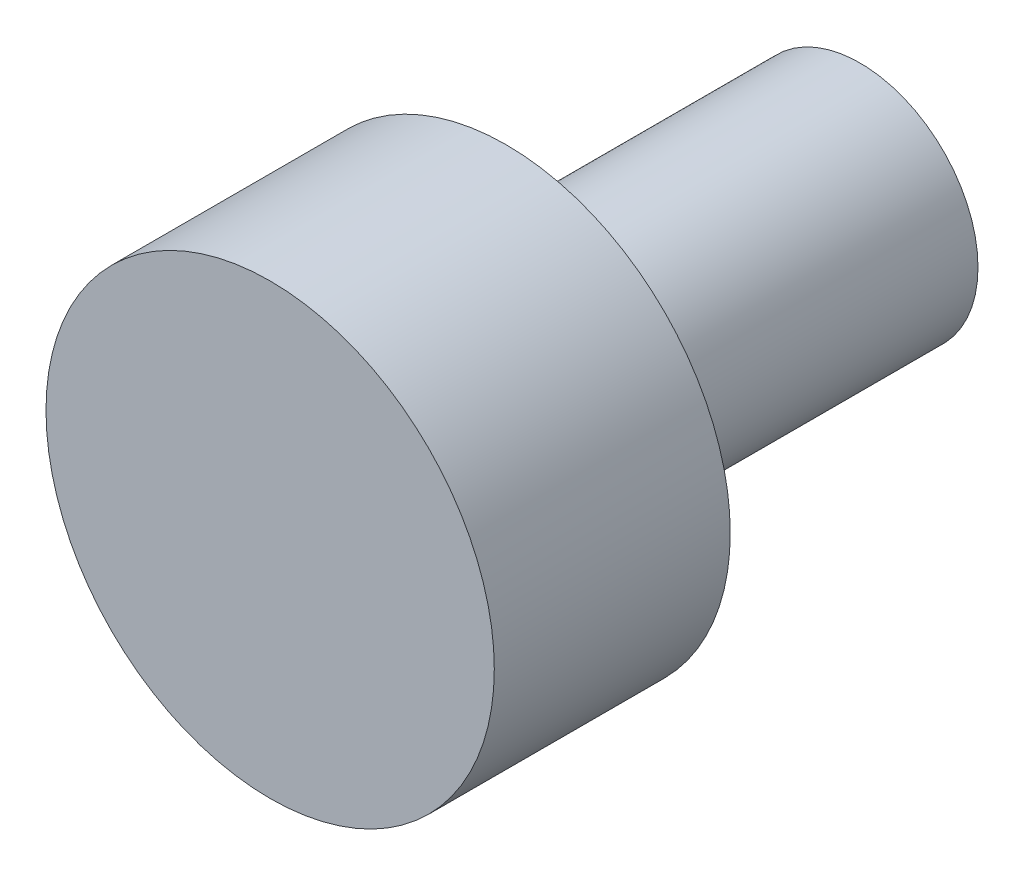
ISO-10303-21;
HEADER;
FILE_DESCRIPTION(('STEP AP214'),'2;1');
FILE_NAME('part.step','',(''),(''),'','','');
FILE_SCHEMA(('AUTOMOTIVE_DESIGN { 1 0 10303 214 1 1 1 1 }'));
ENDSEC;
DATA;
#1=APPLICATION_CONTEXT('core data for automotive mechanical design processes');
#2=APPLICATION_PROTOCOL_DEFINITION('international standard','automotive_design',2000,#1);
#3=PRODUCT_CONTEXT('',#1,'mechanical');
#4=PRODUCT('Part','Part','',(#3));
#5=PRODUCT_RELATED_PRODUCT_CATEGORY('part','',(#4));
#6=PRODUCT_DEFINITION_FORMATION('','',#4);
#7=PRODUCT_DEFINITION_CONTEXT('part definition',#1,'design');
#8=PRODUCT_DEFINITION('design','',#6,#7);
#9=PRODUCT_DEFINITION_SHAPE('','',#8);
#10=(LENGTH_UNIT() NAMED_UNIT(*) SI_UNIT(.MILLI.,.METRE.));
#11=(NAMED_UNIT(*) PLANE_ANGLE_UNIT() SI_UNIT($,.RADIAN.));
#12=(NAMED_UNIT(*) SI_UNIT($,.STERADIAN.) SOLID_ANGLE_UNIT());
#13=UNCERTAINTY_MEASURE_WITH_UNIT(LENGTH_MEASURE(1.E-05),#10,'distance_accuracy_value','');
#14=(GEOMETRIC_REPRESENTATION_CONTEXT(3) GLOBAL_UNCERTAINTY_ASSIGNED_CONTEXT((#13)) GLOBAL_UNIT_ASSIGNED_CONTEXT((#10,
#11,#12)) REPRESENTATION_CONTEXT('',''));
#15=CARTESIAN_POINT('',(0.,0.,0.));
#16=DIRECTION('',(0.,0.,1.));
#17=DIRECTION('',(1.,0.,0.));
#18=AXIS2_PLACEMENT_3D('',#15,#16,#17);
#19=CARTESIAN_POINT('',(0.,0.,0.));
#20=DIRECTION('',(0.,0.,-1.));
#21=DIRECTION('',(-1.,0.,0.));
#22=AXIS2_PLACEMENT_3D('',#19,#20,#21);
#23=CYLINDRICAL_SURFACE('',#22,1.);
#24=CARTESIAN_POINT('',(0.,0.,0.));
#25=DIRECTION('',(0.,0.,1.));
#26=DIRECTION('',(1.,0.,0.));
#27=AXIS2_PLACEMENT_3D('',#24,#25,#26);
#28=CIRCLE('',#27,1.);
#29=CARTESIAN_POINT('',(1.,0.,0.));
#30=VERTEX_POINT('',#29);
#31=EDGE_CURVE('E10',#30,#30,#28,.T.);
#32=ORIENTED_EDGE('',*,*,#31,.F.);
#33=EDGE_LOOP('',(#32));
#34=FACE_BOUND('',#33,.T.);
#35=CARTESIAN_POINT('',(0.,0.,-3.));
#36=DIRECTION('',(0.,0.,1.));
#37=DIRECTION('',(1.,0.,0.));
#38=AXIS2_PLACEMENT_3D('',#35,#36,#37);
#39=CIRCLE('',#38,1.);
#40=CARTESIAN_POINT('',(1.,0.,-3.));
#41=VERTEX_POINT('',#40);
#42=EDGE_CURVE('E37',#41,#41,#39,.T.);
#43=ORIENTED_EDGE('',*,*,#42,.T.);
#44=EDGE_LOOP('',(#43));
#45=FACE_BOUND('',#44,.T.);
#46=ADVANCED_FACE('F40',(#34,#45),#23,.T.);
#47=CARTESIAN_POINT('',(0.,0.,-3.));
#48=DIRECTION('',(0.,0.,1.));
#49=DIRECTION('',(1.,0.,0.));
#50=AXIS2_PLACEMENT_3D('',#47,#48,#49);
#51=PLANE('',#50);
#52=ORIENTED_EDGE('',*,*,#42,.F.);
#53=EDGE_LOOP('',(#52));
#54=FACE_BOUND('',#53,.T.);
#55=ADVANCED_FACE('F58',(#54),#51,.F.);
#56=CARTESIAN_POINT('',(0.,0.,2.));
#57=DIRECTION('',(0.,0.,-1.));
#58=DIRECTION('',(-1.,0.,0.));
#59=AXIS2_PLACEMENT_3D('',#56,#57,#58);
#60=CYLINDRICAL_SURFACE('',#59,1.9);
#61=CARTESIAN_POINT('',(0.,0.,2.));
#62=DIRECTION('',(0.,0.,1.));
#63=DIRECTION('',(1.,0.,0.));
#64=AXIS2_PLACEMENT_3D('',#61,#62,#63);
#65=CIRCLE('',#64,1.9);
#66=CARTESIAN_POINT('',(1.9,0.,2.));
#67=VERTEX_POINT('',#66);
#68=EDGE_CURVE('E50',#67,#67,#65,.T.);
#69=ORIENTED_EDGE('',*,*,#68,.F.);
#70=EDGE_LOOP('',(#69));
#71=FACE_BOUND('',#70,.T.);
#72=CARTESIAN_POINT('',(0.,0.,0.));
#73=DIRECTION('',(0.,0.,1.));
#74=DIRECTION('',(1.,0.,0.));
#75=AXIS2_PLACEMENT_3D('',#72,#73,#74);
#76=CIRCLE('',#75,1.9);
#77=CARTESIAN_POINT('',(1.9,0.,0.));
#78=VERTEX_POINT('',#77);
#79=EDGE_CURVE('E47',#78,#78,#76,.T.);
#80=ORIENTED_EDGE('',*,*,#79,.T.);
#81=EDGE_LOOP('',(#80));
#82=FACE_BOUND('',#81,.T.);
#83=ADVANCED_FACE('F60',(#71,#82),#60,.T.);
#84=CARTESIAN_POINT('',(0.,0.,2.));
#85=DIRECTION('',(0.,0.,1.));
#86=DIRECTION('',(1.,0.,0.));
#87=AXIS2_PLACEMENT_3D('',#84,#85,#86);
#88=PLANE('',#87);
#89=ORIENTED_EDGE('',*,*,#68,.T.);
#90=EDGE_LOOP('',(#89));
#91=FACE_BOUND('',#90,.T.);
#92=ADVANCED_FACE('F54',(#91),#88,.T.);
#93=CARTESIAN_POINT('',(0.,0.,0.));
#94=DIRECTION('',(0.,0.,1.));
#95=DIRECTION('',(1.,0.,0.));
#96=AXIS2_PLACEMENT_3D('',#93,#94,#95);
#97=PLANE('',#96);
#98=ORIENTED_EDGE('',*,*,#31,.T.);
#99=EDGE_LOOP('',(#98));
#100=FACE_BOUND('',#99,.T.);
#101=ORIENTED_EDGE('',*,*,#79,.F.);
#102=EDGE_LOOP('',(#101));
#103=FACE_BOUND('',#102,.T.);
#104=ADVANCED_FACE('F63',(#100,#103),#97,.F.);
#105=CLOSED_SHELL('',(#46,#55,#83,#92,#104));
#106=MANIFOLD_SOLID_BREP('B2',#105);
#107=ADVANCED_BREP_SHAPE_REPRESENTATION('',(#18,#106),#14);
#108=SHAPE_DEFINITION_REPRESENTATION(#9,#107);
ENDSEC;
END-ISO-10303-21;
